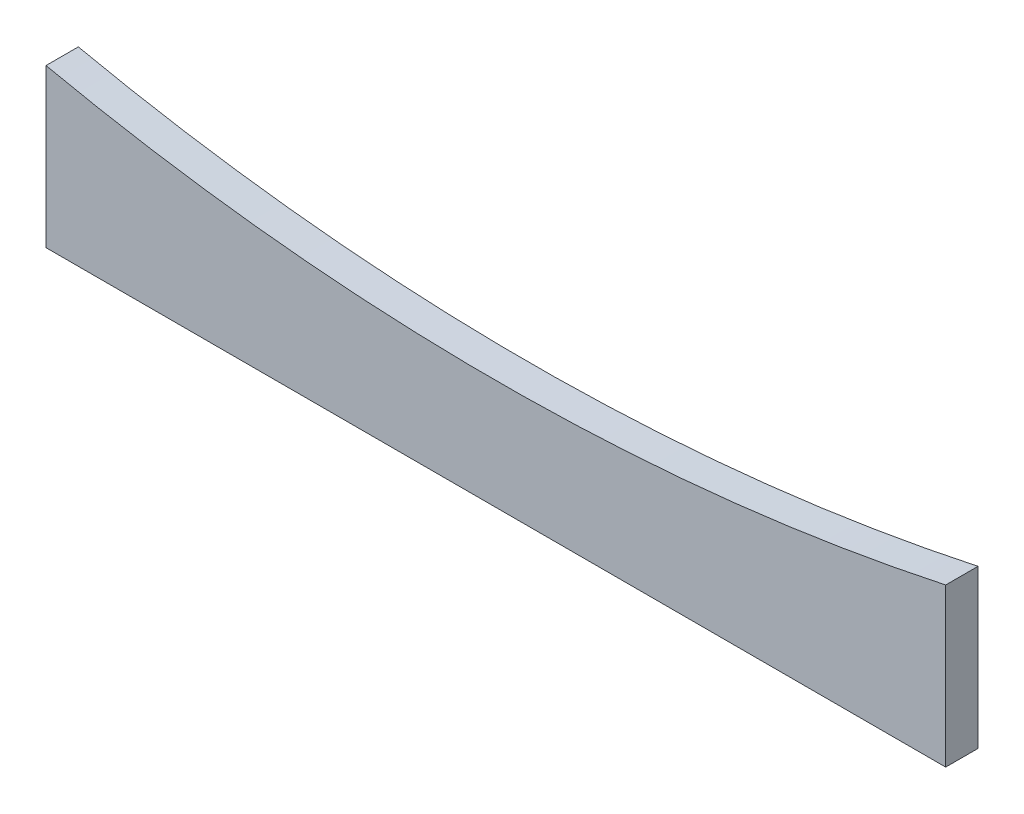
ISO-10303-21;
HEADER;
FILE_DESCRIPTION(('STEP AP214'),'2;1');
FILE_NAME('part.step','',(''),(''),'','','');
FILE_SCHEMA(('AUTOMOTIVE_DESIGN { 1 0 10303 214 1 1 1 1 }'));
ENDSEC;
DATA;
#1=APPLICATION_CONTEXT('core data for automotive mechanical design processes');
#2=APPLICATION_PROTOCOL_DEFINITION('international standard','automotive_design',2000,#1);
#3=PRODUCT_CONTEXT('',#1,'mechanical');
#4=PRODUCT('Part','Part','',(#3));
#5=PRODUCT_RELATED_PRODUCT_CATEGORY('part','',(#4));
#6=PRODUCT_DEFINITION_FORMATION('','',#4);
#7=PRODUCT_DEFINITION_CONTEXT('part definition',#1,'design');
#8=PRODUCT_DEFINITION('design','',#6,#7);
#9=PRODUCT_DEFINITION_SHAPE('','',#8);
#10=(LENGTH_UNIT() NAMED_UNIT(*) SI_UNIT(.MILLI.,.METRE.));
#11=(NAMED_UNIT(*) PLANE_ANGLE_UNIT() SI_UNIT($,.RADIAN.));
#12=(NAMED_UNIT(*) SI_UNIT($,.STERADIAN.) SOLID_ANGLE_UNIT());
#13=UNCERTAINTY_MEASURE_WITH_UNIT(LENGTH_MEASURE(1.E-05),#10,'distance_accuracy_value','');
#14=(GEOMETRIC_REPRESENTATION_CONTEXT(3) GLOBAL_UNCERTAINTY_ASSIGNED_CONTEXT((#13)) GLOBAL_UNIT_ASSIGNED_CONTEXT((#10,
#11,#12)) REPRESENTATION_CONTEXT('',''));
#15=CARTESIAN_POINT('',(0.,0.,0.));
#16=DIRECTION('',(0.,0.,1.));
#17=DIRECTION('',(1.,0.,0.));
#18=AXIS2_PLACEMENT_3D('',#15,#16,#17);
#19=CARTESIAN_POINT('',(33.7221855981926,429.25310726091,-6.35));
#20=DIRECTION('',(0.,0.,1.));
#21=DIRECTION('',(1.,0.,0.));
#22=AXIS2_PLACEMENT_3D('',#19,#20,#21);
#23=CYLINDRICAL_SURFACE('',#22,420.);
#24=CARTESIAN_POINT('',(33.7221855981926,429.25310726091,0.));
#25=DIRECTION('',(0.,0.,-1.));
#26=DIRECTION('',(1.,0.,0.));
#27=AXIS2_PLACEMENT_3D('',#24,#25,#26);
#28=CIRCLE('',#27,420.);
#29=CARTESIAN_POINT('',(122.122185598193,18.6615340400271,0.));
#30=VERTEX_POINT('',#29);
#31=CARTESIAN_POINT('',(-54.6778144018074,18.661534040027,0.));
#32=VERTEX_POINT('',#31);
#33=EDGE_CURVE('E104',#30,#32,#28,.T.);
#34=ORIENTED_EDGE('',*,*,#33,.F.);
#35=DIRECTION('',(0.,0.,1.));
#36=VECTOR('',#35,1.);
#37=CARTESIAN_POINT('',(122.122185598193,18.6615340400271,-6.35));
#38=LINE('',#37,#36);
#39=CARTESIAN_POINT('',(122.122185598193,18.6615340400271,-6.35));
#40=VERTEX_POINT('',#39);
#41=EDGE_CURVE('E11',#40,#30,#38,.T.);
#42=ORIENTED_EDGE('',*,*,#41,.F.);
#43=CARTESIAN_POINT('',(33.7221855981926,429.25310726091,-6.35));
#44=DIRECTION('',(0.,0.,-1.));
#45=DIRECTION('',(1.,0.,0.));
#46=AXIS2_PLACEMENT_3D('',#43,#44,#45);
#47=CIRCLE('',#46,420.);
#48=CARTESIAN_POINT('',(-54.6778144018074,18.661534040027,-6.35));
#49=VERTEX_POINT('',#48);
#50=EDGE_CURVE('E98',#40,#49,#47,.T.);
#51=ORIENTED_EDGE('',*,*,#50,.T.);
#52=DIRECTION('',(0.,0.,1.));
#53=VECTOR('',#52,1.);
#54=CARTESIAN_POINT('',(-54.6778144018074,18.661534040027,-6.35));
#55=LINE('',#54,#53);
#56=EDGE_CURVE('E43',#49,#32,#55,.T.);
#57=ORIENTED_EDGE('',*,*,#56,.T.);
#58=EDGE_LOOP('',(#34,#42,#51,#57));
#59=FACE_BOUND('',#58,.T.);
#60=ADVANCED_FACE('F40',(#59),#23,.F.);
#61=CARTESIAN_POINT('',(122.122185598193,-12.3384659599729,-6.35));
#62=DIRECTION('',(1.,0.,0.));
#63=DIRECTION('',(0.,1.,0.));
#64=AXIS2_PLACEMENT_3D('',#61,#62,#63);
#65=PLANE('',#64);
#66=DIRECTION('',(0.,1.,0.));
#67=VECTOR('',#66,1.);
#68=CARTESIAN_POINT('',(122.122185598193,-12.3384659599729,0.));
#69=LINE('',#68,#67);
#70=CARTESIAN_POINT('',(122.122185598193,-12.3384659599729,0.));
#71=VERTEX_POINT('',#70);
#72=EDGE_CURVE('E100',#71,#30,#69,.T.);
#73=ORIENTED_EDGE('',*,*,#72,.F.);
#74=DIRECTION('',(0.,0.,1.));
#75=VECTOR('',#74,1.);
#76=CARTESIAN_POINT('',(122.122185598193,-12.3384659599729,-6.35));
#77=LINE('',#76,#75);
#78=CARTESIAN_POINT('',(122.122185598193,-12.3384659599729,-6.35));
#79=VERTEX_POINT('',#78);
#80=EDGE_CURVE('E49',#79,#71,#77,.T.);
#81=ORIENTED_EDGE('',*,*,#80,.F.);
#82=DIRECTION('',(0.,1.,0.));
#83=VECTOR('',#82,1.);
#84=CARTESIAN_POINT('',(122.122185598193,-12.3384659599729,-6.35));
#85=LINE('',#84,#83);
#86=EDGE_CURVE('E95',#79,#40,#85,.T.);
#87=ORIENTED_EDGE('',*,*,#86,.T.);
#88=ORIENTED_EDGE('',*,*,#41,.T.);
#89=EDGE_LOOP('',(#73,#81,#87,#88));
#90=FACE_BOUND('',#89,.T.);
#91=ADVANCED_FACE('F114',(#90),#65,.T.);
#92=CARTESIAN_POINT('',(-54.6778144018074,-12.338465959973,-6.35));
#93=DIRECTION('',(0.,-1.,0.));
#94=DIRECTION('',(1.,0.,0.));
#95=AXIS2_PLACEMENT_3D('',#92,#93,#94);
#96=PLANE('',#95);
#97=DIRECTION('',(1.,0.,0.));
#98=VECTOR('',#97,1.);
#99=CARTESIAN_POINT('',(-54.6778144018074,-12.338465959973,0.));
#100=LINE('',#99,#98);
#101=CARTESIAN_POINT('',(-54.6778144018074,-12.338465959973,0.));
#102=VERTEX_POINT('',#101);
#103=EDGE_CURVE('E90',#102,#71,#100,.T.);
#104=ORIENTED_EDGE('',*,*,#103,.F.);
#105=DIRECTION('',(0.,0.,1.));
#106=VECTOR('',#105,1.);
#107=CARTESIAN_POINT('',(-54.6778144018074,-12.338465959973,-6.35));
#108=LINE('',#107,#106);
#109=CARTESIAN_POINT('',(-54.6778144018074,-12.338465959973,-6.35));
#110=VERTEX_POINT('',#109);
#111=EDGE_CURVE('E85',#110,#102,#108,.T.);
#112=ORIENTED_EDGE('',*,*,#111,.F.);
#113=DIRECTION('',(1.,0.,0.));
#114=VECTOR('',#113,1.);
#115=CARTESIAN_POINT('',(-54.6778144018074,-12.338465959973,-6.35));
#116=LINE('',#115,#114);
#117=EDGE_CURVE('E88',#110,#79,#116,.T.);
#118=ORIENTED_EDGE('',*,*,#117,.T.);
#119=ORIENTED_EDGE('',*,*,#80,.T.);
#120=EDGE_LOOP('',(#104,#112,#118,#119));
#121=FACE_BOUND('',#120,.T.);
#122=ADVANCED_FACE('F87',(#121),#96,.T.);
#123=CARTESIAN_POINT('',(-54.6778144018074,18.661534040027,-6.35));
#124=DIRECTION('',(-1.,0.,0.));
#125=DIRECTION('',(0.,-1.,0.));
#126=AXIS2_PLACEMENT_3D('',#123,#124,#125);
#127=PLANE('',#126);
#128=DIRECTION('',(0.,-1.,0.));
#129=VECTOR('',#128,1.);
#130=CARTESIAN_POINT('',(-54.6778144018074,18.661534040027,0.));
#131=LINE('',#130,#129);
#132=EDGE_CURVE('E107',#32,#102,#131,.T.);
#133=ORIENTED_EDGE('',*,*,#132,.F.);
#134=ORIENTED_EDGE('',*,*,#56,.F.);
#135=DIRECTION('',(0.,-1.,0.));
#136=VECTOR('',#135,1.);
#137=CARTESIAN_POINT('',(-54.6778144018074,18.661534040027,-6.35));
#138=LINE('',#137,#136);
#139=EDGE_CURVE('E94',#49,#110,#138,.T.);
#140=ORIENTED_EDGE('',*,*,#139,.T.);
#141=ORIENTED_EDGE('',*,*,#111,.T.);
#142=EDGE_LOOP('',(#133,#134,#140,#141));
#143=FACE_BOUND('',#142,.T.);
#144=ADVANCED_FACE('F97',(#143),#127,.T.);
#145=CARTESIAN_POINT('',(33.7221855981926,429.25310726091,-6.35));
#146=DIRECTION('',(0.,0.,1.));
#147=DIRECTION('',(1.,0.,0.));
#148=AXIS2_PLACEMENT_3D('',#145,#146,#147);
#149=PLANE('',#148);
#150=ORIENTED_EDGE('',*,*,#50,.F.);
#151=ORIENTED_EDGE('',*,*,#86,.F.);
#152=ORIENTED_EDGE('',*,*,#117,.F.);
#153=ORIENTED_EDGE('',*,*,#139,.F.);
#154=EDGE_LOOP('',(#150,#151,#152,#153));
#155=FACE_BOUND('',#154,.T.);
#156=ADVANCED_FACE('F93',(#155),#149,.F.);
#157=CARTESIAN_POINT('',(33.7221855981926,429.25310726091,0.));
#158=DIRECTION('',(0.,0.,1.));
#159=DIRECTION('',(1.,0.,0.));
#160=AXIS2_PLACEMENT_3D('',#157,#158,#159);
#161=PLANE('',#160);
#162=ORIENTED_EDGE('',*,*,#33,.T.);
#163=ORIENTED_EDGE('',*,*,#132,.T.);
#164=ORIENTED_EDGE('',*,*,#103,.T.);
#165=ORIENTED_EDGE('',*,*,#72,.T.);
#166=EDGE_LOOP('',(#162,#163,#164,#165));
#167=FACE_BOUND('',#166,.T.);
#168=ADVANCED_FACE('F113',(#167),#161,.T.);
#169=CLOSED_SHELL('',(#60,#91,#122,#144,#156,#168));
#170=MANIFOLD_SOLID_BREP('B2',#169);
#171=ADVANCED_BREP_SHAPE_REPRESENTATION('',(#18,#170),#14);
#172=SHAPE_DEFINITION_REPRESENTATION(#9,#171);
ENDSEC;
END-ISO-10303-21;
